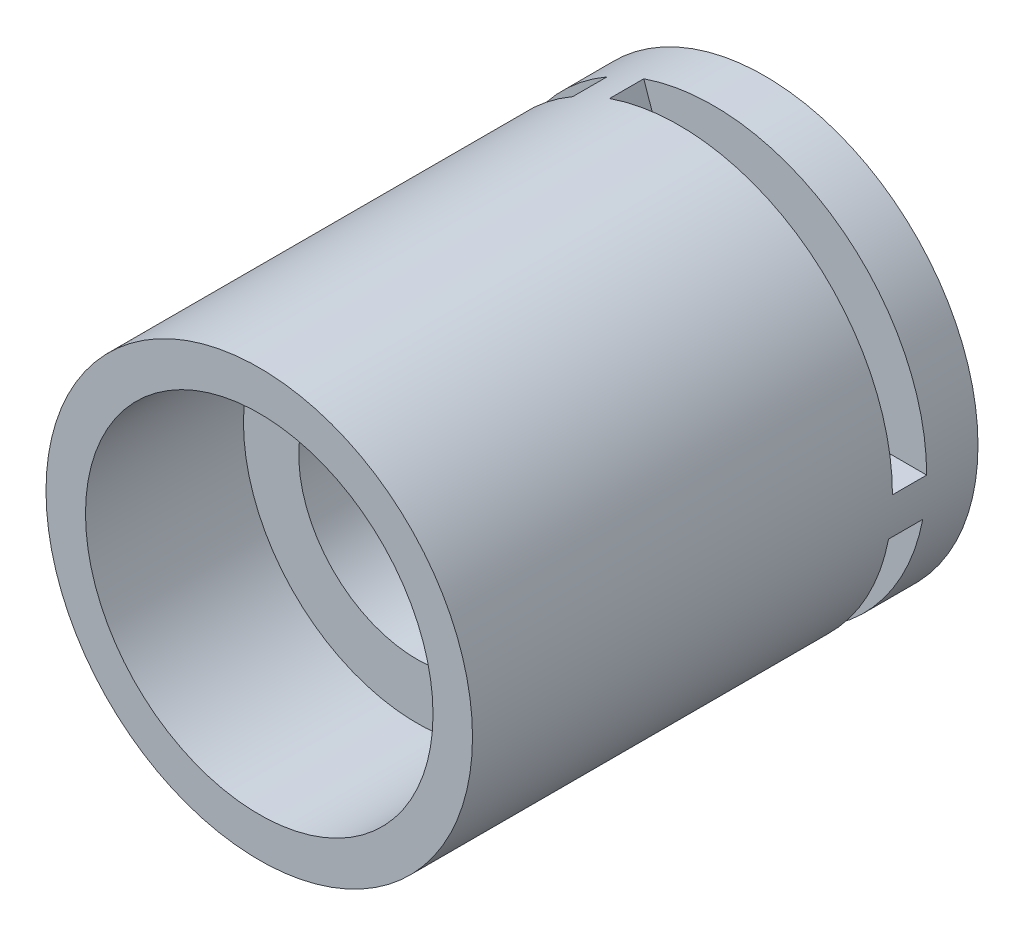
ISO-10303-21;
HEADER;
FILE_DESCRIPTION(('STEP AP214'),'2;1');
FILE_NAME('part.step','',(''),(''),'','','');
FILE_SCHEMA(('AUTOMOTIVE_DESIGN { 1 0 10303 214 1 1 1 1 }'));
ENDSEC;
DATA;
#1=APPLICATION_CONTEXT('core data for automotive mechanical design processes');
#2=APPLICATION_PROTOCOL_DEFINITION('international standard','automotive_design',2000,#1);
#3=PRODUCT_CONTEXT('',#1,'mechanical');
#4=PRODUCT('Part','Part','',(#3));
#5=PRODUCT_RELATED_PRODUCT_CATEGORY('part','',(#4));
#6=PRODUCT_DEFINITION_FORMATION('','',#4);
#7=PRODUCT_DEFINITION_CONTEXT('part definition',#1,'design');
#8=PRODUCT_DEFINITION('design','',#6,#7);
#9=PRODUCT_DEFINITION_SHAPE('','',#8);
#10=(LENGTH_UNIT() NAMED_UNIT(*) SI_UNIT(.MILLI.,.METRE.));
#11=(NAMED_UNIT(*) PLANE_ANGLE_UNIT() SI_UNIT($,.RADIAN.));
#12=(NAMED_UNIT(*) SI_UNIT($,.STERADIAN.) SOLID_ANGLE_UNIT());
#13=UNCERTAINTY_MEASURE_WITH_UNIT(LENGTH_MEASURE(1.E-05),#10,'distance_accuracy_value','');
#14=(GEOMETRIC_REPRESENTATION_CONTEXT(3) GLOBAL_UNCERTAINTY_ASSIGNED_CONTEXT((#13)) GLOBAL_UNIT_ASSIGNED_CONTEXT((#10,
#11,#12)) REPRESENTATION_CONTEXT('',''));
#15=CARTESIAN_POINT('',(0.,0.,0.));
#16=DIRECTION('',(0.,0.,1.));
#17=DIRECTION('',(1.,0.,0.));
#18=AXIS2_PLACEMENT_3D('',#15,#16,#17);
#19=CARTESIAN_POINT('',(0.,0.,-32.));
#20=DIRECTION('',(0.,0.,1.));
#21=DIRECTION('',(1.,0.,0.));
#22=AXIS2_PLACEMENT_3D('',#19,#20,#21);
#23=CYLINDRICAL_SURFACE('',#22,13.5);
#24=DIRECTION('',(0.,0.,-1.));
#25=VECTOR('',#24,1.);
#26=CARTESIAN_POINT('',(-6.76119355948094,-11.6848731979099,-26.584));
#27=LINE('',#26,#25);
#28=CARTESIAN_POINT('',(-6.76119355948094,-11.6848731979099,-26.584));
#29=VERTEX_POINT('',#28);
#30=CARTESIAN_POINT('',(-6.76119355948095,-11.6848731979099,-28.75));
#31=VERTEX_POINT('',#30);
#32=EDGE_CURVE('E233',#29,#31,#27,.T.);
#33=ORIENTED_EDGE('',*,*,#32,.F.);
#34=CARTESIAN_POINT('',(0.,0.,-26.584));
#35=DIRECTION('',(0.,0.,1.));
#36=DIRECTION('',(0.981832280842699,-0.189750816322946,0.));
#37=AXIS2_PLACEMENT_3D('',#34,#35,#36);
#38=CIRCLE('',#37,13.5);
#39=CARTESIAN_POINT('',(13.2547357913764,-2.56163602035977,-26.584));
#40=VERTEX_POINT('',#39);
#41=EDGE_CURVE('E237',#29,#40,#38,.T.);
#42=ORIENTED_EDGE('',*,*,#41,.T.);
#43=DIRECTION('',(0.,0.,1.));
#44=VECTOR('',#43,1.);
#45=CARTESIAN_POINT('',(13.2547357913764,-2.56163602035977,-28.75));
#46=LINE('',#45,#44);
#47=CARTESIAN_POINT('',(13.2547357913764,-2.56163602035977,-28.75));
#48=VERTEX_POINT('',#47);
#49=EDGE_CURVE('E147',#48,#40,#46,.T.);
#50=ORIENTED_EDGE('',*,*,#49,.F.);
#51=CARTESIAN_POINT('',(0.,0.,-28.75));
#52=DIRECTION('',(0.,0.,1.));
#53=DIRECTION('',(0.981832280842699,-0.189750816322946,0.));
#54=AXIS2_PLACEMENT_3D('',#51,#52,#53);
#55=CIRCLE('',#54,13.5);
#56=EDGE_CURVE('E227',#31,#48,#55,.T.);
#57=ORIENTED_EDGE('',*,*,#56,.F.);
#58=EDGE_LOOP('',(#33,#42,#50,#57));
#59=FACE_BOUND('',#58,.T.);
#60=DIRECTION('',(0.,0.,-1.));
#61=VECTOR('',#60,1.);
#62=CARTESIAN_POINT('',(-6.73880024964936,11.6978019813692,-26.584));
#63=LINE('',#62,#61);
#64=CARTESIAN_POINT('',(-6.73880024964936,11.6978019813692,-26.584));
#65=VERTEX_POINT('',#64);
#66=CARTESIAN_POINT('',(-6.73880024964935,11.6978019813692,-28.75));
#67=VERTEX_POINT('',#66);
#68=EDGE_CURVE('E253',#65,#67,#63,.T.);
#69=ORIENTED_EDGE('',*,*,#68,.F.);
#70=CARTESIAN_POINT('',(0.,0.,-26.584));
#71=DIRECTION('',(0.,0.,1.));
#72=DIRECTION('',(-0.655245167745859,-0.755416289303918,0.));
#73=AXIS2_PLACEMENT_3D('',#70,#71,#72);
#74=CIRCLE('',#73,13.5);
#75=CARTESIAN_POINT('',(-8.8458097645691,-10.1981199056029,-26.584));
#76=VERTEX_POINT('',#75);
#77=EDGE_CURVE('E256',#65,#76,#74,.T.);
#78=ORIENTED_EDGE('',*,*,#77,.T.);
#79=DIRECTION('',(0.,0.,1.));
#80=VECTOR('',#79,1.);
#81=CARTESIAN_POINT('',(-8.8458097645691,-10.1981199056029,-28.75));
#82=LINE('',#81,#80);
#83=CARTESIAN_POINT('',(-8.8458097645691,-10.1981199056029,-28.75));
#84=VERTEX_POINT('',#83);
#85=EDGE_CURVE('E247',#84,#76,#82,.T.);
#86=ORIENTED_EDGE('',*,*,#85,.F.);
#87=CARTESIAN_POINT('',(0.,0.,-28.75));
#88=DIRECTION('',(0.,0.,1.));
#89=DIRECTION('',(-0.655245167745859,-0.755416289303918,0.));
#90=AXIS2_PLACEMENT_3D('',#87,#88,#89);
#91=CIRCLE('',#90,13.5);
#92=EDGE_CURVE('E249',#67,#84,#91,.T.);
#93=ORIENTED_EDGE('',*,*,#92,.F.);
#94=EDGE_LOOP('',(#69,#78,#86,#93));
#95=FACE_BOUND('',#94,.T.);
#96=DIRECTION('',(0.,0.,-1.));
#97=VECTOR('',#96,1.);
#98=CARTESIAN_POINT('',(13.4999938091304,-0.0129287834596039,-26.584));
#99=LINE('',#98,#97);
#100=CARTESIAN_POINT('',(13.4999938091304,-0.0129287834596039,-26.584));
#101=VERTEX_POINT('',#100);
#102=CARTESIAN_POINT('',(13.4999938091304,-0.0129287834596068,-28.75));
#103=VERTEX_POINT('',#102);
#104=EDGE_CURVE('E274',#101,#103,#99,.T.);
#105=ORIENTED_EDGE('',*,*,#104,.F.);
#106=CARTESIAN_POINT('',(0.,0.,-26.584));
#107=DIRECTION('',(0.,0.,1.));
#108=DIRECTION('',(-0.326587113096821,0.945167105626875,0.));
#109=AXIS2_PLACEMENT_3D('',#106,#107,#108);
#110=CIRCLE('',#109,13.5);
#111=CARTESIAN_POINT('',(-4.40892602680708,12.7597559259628,-26.584));
#112=VERTEX_POINT('',#111);
#113=EDGE_CURVE('E278',#101,#112,#110,.T.);
#114=ORIENTED_EDGE('',*,*,#113,.T.);
#115=DIRECTION('',(0.,0.,1.));
#116=VECTOR('',#115,1.);
#117=CARTESIAN_POINT('',(-4.40892602680708,12.7597559259628,-28.75));
#118=LINE('',#117,#116);
#119=CARTESIAN_POINT('',(-4.40892602680708,12.7597559259628,-28.75));
#120=VERTEX_POINT('',#119);
#121=EDGE_CURVE('E266',#120,#112,#118,.T.);
#122=ORIENTED_EDGE('',*,*,#121,.F.);
#123=CARTESIAN_POINT('',(0.,0.,-28.75));
#124=DIRECTION('',(0.,0.,1.));
#125=DIRECTION('',(-0.326587113096821,0.945167105626875,0.));
#126=AXIS2_PLACEMENT_3D('',#123,#124,#125);
#127=CIRCLE('',#126,13.5);
#128=EDGE_CURVE('E269',#103,#120,#127,.T.);
#129=ORIENTED_EDGE('',*,*,#128,.F.);
#130=EDGE_LOOP('',(#105,#114,#122,#129));
#131=FACE_BOUND('',#130,.T.);
#132=CARTESIAN_POINT('',(0.,0.,-32.));
#133=DIRECTION('',(0.,0.,1.));
#134=DIRECTION('',(1.,0.,0.));
#135=AXIS2_PLACEMENT_3D('',#132,#133,#134);
#136=CIRCLE('',#135,13.5);
#137=CARTESIAN_POINT('',(13.5,0.,-32.));
#138=VERTEX_POINT('',#137);
#139=EDGE_CURVE('E303',#138,#138,#136,.T.);
#140=ORIENTED_EDGE('',*,*,#139,.T.);
#141=EDGE_LOOP('',(#140));
#142=FACE_BOUND('',#141,.T.);
#143=CARTESIAN_POINT('',(0.,0.,0.));
#144=DIRECTION('',(0.,0.,1.));
#145=DIRECTION('',(1.,0.,0.));
#146=AXIS2_PLACEMENT_3D('',#143,#144,#145);
#147=CIRCLE('',#146,13.5);
#148=CARTESIAN_POINT('',(13.5,0.,0.));
#149=VERTEX_POINT('',#148);
#150=EDGE_CURVE('E299',#149,#149,#147,.T.);
#151=ORIENTED_EDGE('',*,*,#150,.F.);
#152=EDGE_LOOP('',(#151));
#153=FACE_BOUND('',#152,.T.);
#154=ADVANCED_FACE('F133',(#59,#95,#131,#142,#153),#23,.T.);
#155=CARTESIAN_POINT('',(0.,0.,-32.));
#156=DIRECTION('',(0.,0.,1.));
#157=DIRECTION('',(1.,0.,0.));
#158=AXIS2_PLACEMENT_3D('',#155,#156,#157);
#159=PLANE('',#158);
#160=ORIENTED_EDGE('',*,*,#139,.F.);
#161=EDGE_LOOP('',(#160));
#162=FACE_BOUND('',#161,.T.);
#163=ADVANCED_FACE('F353',(#162),#159,.F.);
#164=CARTESIAN_POINT('',(0.,0.,0.));
#165=DIRECTION('',(0.,0.,1.));
#166=DIRECTION('',(1.,0.,0.));
#167=AXIS2_PLACEMENT_3D('',#164,#165,#166);
#168=PLANE('',#167);
#169=CARTESIAN_POINT('',(0.,0.,0.));
#170=DIRECTION('',(0.,0.,1.));
#171=DIRECTION('',(1.,0.,0.));
#172=AXIS2_PLACEMENT_3D('',#169,#170,#171);
#173=CIRCLE('',#172,11.);
#174=CARTESIAN_POINT('',(11.,0.,0.));
#175=VERTEX_POINT('',#174);
#176=EDGE_CURVE('E300',#175,#175,#173,.T.);
#177=ORIENTED_EDGE('',*,*,#176,.F.);
#178=EDGE_LOOP('',(#177));
#179=FACE_BOUND('',#178,.T.);
#180=ORIENTED_EDGE('',*,*,#150,.T.);
#181=EDGE_LOOP('',(#180));
#182=FACE_BOUND('',#181,.T.);
#183=ADVANCED_FACE('F357',(#179,#182),#168,.T.);
#184=CARTESIAN_POINT('',(0.,0.,-10.));
#185=DIRECTION('',(0.,0.,1.));
#186=DIRECTION('',(1.,0.,0.));
#187=AXIS2_PLACEMENT_3D('',#184,#185,#186);
#188=CYLINDRICAL_SURFACE('',#187,11.);
#189=CARTESIAN_POINT('',(0.,0.,-10.));
#190=DIRECTION('',(0.,0.,1.));
#191=DIRECTION('',(1.,0.,0.));
#192=AXIS2_PLACEMENT_3D('',#189,#190,#191);
#193=CIRCLE('',#192,11.);
#194=CARTESIAN_POINT('',(11.,0.,-10.));
#195=VERTEX_POINT('',#194);
#196=EDGE_CURVE('E296',#195,#195,#193,.T.);
#197=ORIENTED_EDGE('',*,*,#196,.F.);
#198=EDGE_LOOP('',(#197));
#199=FACE_BOUND('',#198,.T.);
#200=ORIENTED_EDGE('',*,*,#176,.T.);
#201=EDGE_LOOP('',(#200));
#202=FACE_BOUND('',#201,.T.);
#203=ADVANCED_FACE('F363',(#199,#202),#188,.F.);
#204=CARTESIAN_POINT('',(0.,0.,-10.));
#205=DIRECTION('',(0.,0.,1.));
#206=DIRECTION('',(1.,0.,0.));
#207=AXIS2_PLACEMENT_3D('',#204,#205,#206);
#208=PLANE('',#207);
#209=CARTESIAN_POINT('',(0.,0.,-10.));
#210=DIRECTION('',(0.,0.,1.));
#211=DIRECTION('',(1.,0.,0.));
#212=AXIS2_PLACEMENT_3D('',#209,#210,#211);
#213=CIRCLE('',#212,7.5);
#214=CARTESIAN_POINT('',(7.5,0.,-10.));
#215=VERTEX_POINT('',#214);
#216=EDGE_CURVE('E295',#215,#215,#213,.T.);
#217=ORIENTED_EDGE('',*,*,#216,.F.);
#218=EDGE_LOOP('',(#217));
#219=FACE_BOUND('',#218,.T.);
#220=ORIENTED_EDGE('',*,*,#196,.T.);
#221=EDGE_LOOP('',(#220));
#222=FACE_BOUND('',#221,.T.);
#223=ADVANCED_FACE('F369',(#219,#222),#208,.T.);
#224=CARTESIAN_POINT('',(0.,0.,-30.));
#225=DIRECTION('',(0.,0.,1.));
#226=DIRECTION('',(1.,0.,0.));
#227=AXIS2_PLACEMENT_3D('',#224,#225,#226);
#228=CYLINDRICAL_SURFACE('',#227,7.5);
#229=CARTESIAN_POINT('',(0.,0.,-26.584));
#230=DIRECTION('',(0.,0.,-1.));
#231=DIRECTION('',(-1.,0.,0.));
#232=AXIS2_PLACEMENT_3D('',#229,#230,#231);
#233=CIRCLE('',#232,7.5);
#234=CARTESIAN_POINT('',(7.36374210632024,-1.4231311224221,-26.584));
#235=VERTEX_POINT('',#234);
#236=CARTESIAN_POINT('',(-3.75621864415608,-6.49159622106106,-26.584));
#237=VERTEX_POINT('',#236);
#238=EDGE_CURVE('E334',#235,#237,#233,.T.);
#239=ORIENTED_EDGE('',*,*,#238,.T.);
#240=DIRECTION('',(0.,0.,1.));
#241=VECTOR('',#240,1.);
#242=CARTESIAN_POINT('',(-3.75621864415608,-6.49159622106106,-30.));
#243=LINE('',#242,#241);
#244=CARTESIAN_POINT('',(-3.75621864415609,-6.49159622106106,-28.75));
#245=VERTEX_POINT('',#244);
#246=EDGE_CURVE('E13',#237,#245,#243,.F.);
#247=ORIENTED_EDGE('',*,*,#246,.T.);
#248=CARTESIAN_POINT('',(0.,0.,-28.75));
#249=DIRECTION('',(0.,0.,-1.));
#250=DIRECTION('',(-1.,0.,0.));
#251=AXIS2_PLACEMENT_3D('',#248,#249,#250);
#252=CIRCLE('',#251,7.5);
#253=CARTESIAN_POINT('',(7.36374210632024,-1.4231311224221,-28.75));
#254=VERTEX_POINT('',#253);
#255=EDGE_CURVE('E140',#245,#254,#252,.F.);
#256=ORIENTED_EDGE('',*,*,#255,.T.);
#257=DIRECTION('',(0.,0.,1.));
#258=VECTOR('',#257,1.);
#259=CARTESIAN_POINT('',(7.36374210632024,-1.4231311224221,-30.));
#260=LINE('',#259,#258);
#261=EDGE_CURVE('E337',#254,#235,#260,.T.);
#262=ORIENTED_EDGE('',*,*,#261,.T.);
#263=EDGE_LOOP('',(#239,#247,#256,#262));
#264=FACE_BOUND('',#263,.T.);
#265=CARTESIAN_POINT('',(0.,0.,-26.584));
#266=DIRECTION('',(0.,0.,-1.));
#267=DIRECTION('',(-1.,0.,0.));
#268=AXIS2_PLACEMENT_3D('',#265,#266,#267);
#269=CIRCLE('',#268,7.5);
#270=CARTESIAN_POINT('',(-4.91433875809394,-5.66562216977939,-26.584));
#271=VERTEX_POINT('',#270);
#272=CARTESIAN_POINT('',(-3.74377791647187,6.49877887853846,-26.584));
#273=VERTEX_POINT('',#272);
#274=EDGE_CURVE('E322',#271,#273,#269,.T.);
#275=ORIENTED_EDGE('',*,*,#274,.T.);
#276=DIRECTION('',(0.,0.,1.));
#277=VECTOR('',#276,1.);
#278=CARTESIAN_POINT('',(-3.74377791647187,6.49877887853846,-30.));
#279=LINE('',#278,#277);
#280=CARTESIAN_POINT('',(-3.74377791647186,6.49877887853846,-28.75));
#281=VERTEX_POINT('',#280);
#282=EDGE_CURVE('E331',#273,#281,#279,.F.);
#283=ORIENTED_EDGE('',*,*,#282,.T.);
#284=CARTESIAN_POINT('',(0.,0.,-28.75));
#285=DIRECTION('',(0.,0.,-1.));
#286=DIRECTION('',(-1.,0.,0.));
#287=AXIS2_PLACEMENT_3D('',#284,#285,#286);
#288=CIRCLE('',#287,7.5);
#289=CARTESIAN_POINT('',(-4.91433875809394,-5.66562216977939,-28.75));
#290=VERTEX_POINT('',#289);
#291=EDGE_CURVE('E328',#281,#290,#288,.F.);
#292=ORIENTED_EDGE('',*,*,#291,.T.);
#293=DIRECTION('',(0.,0.,1.));
#294=VECTOR('',#293,1.);
#295=CARTESIAN_POINT('',(-4.91433875809394,-5.66562216977939,-30.));
#296=LINE('',#295,#294);
#297=EDGE_CURVE('E325',#290,#271,#296,.T.);
#298=ORIENTED_EDGE('',*,*,#297,.T.);
#299=EDGE_LOOP('',(#275,#283,#292,#298));
#300=FACE_BOUND('',#299,.T.);
#301=CARTESIAN_POINT('',(0.,0.,-26.584));
#302=DIRECTION('',(0.,0.,-1.));
#303=DIRECTION('',(-1.,0.,0.));
#304=AXIS2_PLACEMENT_3D('',#301,#302,#303);
#305=CIRCLE('',#304,7.5);
#306=CARTESIAN_POINT('',(-2.44940334822615,7.08875329220156,-26.584));
#307=VERTEX_POINT('',#306);
#308=CARTESIAN_POINT('',(7.49999656062798,-0.00718265747755774,-26.584));
#309=VERTEX_POINT('',#308);
#310=EDGE_CURVE('E306',#307,#309,#305,.T.);
#311=ORIENTED_EDGE('',*,*,#310,.T.);
#312=DIRECTION('',(0.,0.,1.));
#313=VECTOR('',#312,1.);
#314=CARTESIAN_POINT('',(7.49999656062798,-0.00718265747755774,-30.));
#315=LINE('',#314,#313);
#316=CARTESIAN_POINT('',(7.49999656062798,-0.00718265747755934,-28.75));
#317=VERTEX_POINT('',#316);
#318=EDGE_CURVE('E319',#309,#317,#315,.F.);
#319=ORIENTED_EDGE('',*,*,#318,.T.);
#320=CARTESIAN_POINT('',(0.,0.,-28.75));
#321=DIRECTION('',(0.,0.,-1.));
#322=DIRECTION('',(-1.,0.,0.));
#323=AXIS2_PLACEMENT_3D('',#320,#321,#322);
#324=CIRCLE('',#323,7.5);
#325=CARTESIAN_POINT('',(-2.44940334822615,7.08875329220156,-28.75));
#326=VERTEX_POINT('',#325);
#327=EDGE_CURVE('E316',#317,#326,#324,.F.);
#328=ORIENTED_EDGE('',*,*,#327,.T.);
#329=DIRECTION('',(0.,0.,1.));
#330=VECTOR('',#329,1.);
#331=CARTESIAN_POINT('',(-2.44940334822615,7.08875329220156,-30.));
#332=LINE('',#331,#330);
#333=EDGE_CURVE('E313',#326,#307,#332,.T.);
#334=ORIENTED_EDGE('',*,*,#333,.T.);
#335=EDGE_LOOP('',(#311,#319,#328,#334));
#336=FACE_BOUND('',#335,.T.);
#337=ORIENTED_EDGE('',*,*,#216,.T.);
#338=EDGE_LOOP('',(#337));
#339=FACE_BOUND('',#338,.T.);
#340=CARTESIAN_POINT('',(0.,0.,-30.));
#341=DIRECTION('',(0.,0.,1.));
#342=DIRECTION('',(1.,0.,0.));
#343=AXIS2_PLACEMENT_3D('',#340,#341,#342);
#344=CIRCLE('',#343,7.5);
#345=CARTESIAN_POINT('',(7.5,0.,-30.));
#346=VERTEX_POINT('',#345);
#347=EDGE_CURVE('E290',#346,#346,#344,.T.);
#348=ORIENTED_EDGE('',*,*,#347,.F.);
#349=EDGE_LOOP('',(#348));
#350=FACE_BOUND('',#349,.T.);
#351=ADVANCED_FACE('F340',(#264,#300,#336,#339,#350),#228,.F.);
#352=CARTESIAN_POINT('',(0.,0.,-30.));
#353=DIRECTION('',(0.,0.,1.));
#354=DIRECTION('',(1.,0.,0.));
#355=AXIS2_PLACEMENT_3D('',#352,#353,#354);
#356=PLANE('',#355);
#357=ORIENTED_EDGE('',*,*,#347,.T.);
#358=EDGE_LOOP('',(#357));
#359=FACE_BOUND('',#358,.T.);
#360=ADVANCED_FACE('F376',(#359),#356,.T.);
#361=CARTESIAN_POINT('',(13.4999938091304,-0.0129287834596039,-27.667));
#362=DIRECTION('',(-0.000957687663674365,-0.999999541417064,0.));
#363=DIRECTION('',(0.,0.,-1.));
#364=AXIS2_PLACEMENT_3D('',#361,#362,#363);
#365=PLANE('',#364);
#366=DIRECTION('',(0.999999541417064,-0.000957687663674365,0.));
#367=VECTOR('',#366,1.);
#368=CARTESIAN_POINT('',(13.4999938091304,-0.0129287834596039,-26.584));
#369=LINE('',#368,#367);
#370=EDGE_CURVE('E288',#309,#101,#369,.T.);
#371=ORIENTED_EDGE('',*,*,#370,.T.);
#372=ORIENTED_EDGE('',*,*,#104,.T.);
#373=DIRECTION('',(0.999999541417064,-0.000957687663674578,0.));
#374=VECTOR('',#373,1.);
#375=CARTESIAN_POINT('',(13.4999938091304,-0.0129287834596068,-28.75));
#376=LINE('',#375,#374);
#377=EDGE_CURVE('E286',#317,#103,#376,.T.);
#378=ORIENTED_EDGE('',*,*,#377,.F.);
#379=ORIENTED_EDGE('',*,*,#318,.F.);
#380=EDGE_LOOP('',(#371,#372,#378,#379));
#381=FACE_BOUND('',#380,.T.);
#382=ADVANCED_FACE('F379',(#381),#365,.F.);
#383=CARTESIAN_POINT('',(0.,0.,-28.75));
#384=DIRECTION('',(0.,0.,-1.));
#385=DIRECTION('',(-1.,0.,0.));
#386=AXIS2_PLACEMENT_3D('',#383,#384,#385);
#387=PLANE('',#386);
#388=ORIENTED_EDGE('',*,*,#377,.T.);
#389=ORIENTED_EDGE('',*,*,#128,.T.);
#390=DIRECTION('',(-0.32658711309682,0.945167105626875,0.));
#391=VECTOR('',#390,1.);
#392=CARTESIAN_POINT('',(-4.40892602680708,12.7597559259628,-28.75));
#393=LINE('',#392,#391);
#394=EDGE_CURVE('E284',#326,#120,#393,.T.);
#395=ORIENTED_EDGE('',*,*,#394,.F.);
#396=ORIENTED_EDGE('',*,*,#327,.F.);
#397=EDGE_LOOP('',(#388,#389,#395,#396));
#398=FACE_BOUND('',#397,.T.);
#399=ADVANCED_FACE('F389',(#398),#387,.F.);
#400=CARTESIAN_POINT('',(-4.40892602680708,12.7597559259628,-27.667));
#401=DIRECTION('',(-0.945167105626875,-0.326587113096821,0.));
#402=DIRECTION('',(0.,0.,1.));
#403=AXIS2_PLACEMENT_3D('',#400,#401,#402);
#404=PLANE('',#403);
#405=ORIENTED_EDGE('',*,*,#394,.T.);
#406=ORIENTED_EDGE('',*,*,#121,.T.);
#407=DIRECTION('',(-0.32658711309682,0.945167105626875,0.));
#408=VECTOR('',#407,1.);
#409=CARTESIAN_POINT('',(-4.40892602680708,12.7597559259628,-26.584));
#410=LINE('',#409,#408);
#411=EDGE_CURVE('E273',#307,#112,#410,.T.);
#412=ORIENTED_EDGE('',*,*,#411,.F.);
#413=ORIENTED_EDGE('',*,*,#333,.F.);
#414=EDGE_LOOP('',(#405,#406,#412,#413));
#415=FACE_BOUND('',#414,.T.);
#416=ADVANCED_FACE('F385',(#415),#404,.F.);
#417=CARTESIAN_POINT('',(0.,0.,-26.584));
#418=DIRECTION('',(0.,0.,-1.));
#419=DIRECTION('',(-1.,0.,0.));
#420=AXIS2_PLACEMENT_3D('',#417,#418,#419);
#421=PLANE('',#420);
#422=ORIENTED_EDGE('',*,*,#411,.T.);
#423=ORIENTED_EDGE('',*,*,#113,.F.);
#424=ORIENTED_EDGE('',*,*,#370,.F.);
#425=ORIENTED_EDGE('',*,*,#310,.F.);
#426=EDGE_LOOP('',(#422,#423,#424,#425));
#427=FACE_BOUND('',#426,.T.);
#428=ADVANCED_FACE('F381',(#427),#421,.T.);
#429=CARTESIAN_POINT('',(-6.73880024964936,11.6978019813692,-27.667));
#430=DIRECTION('',(0.866503850471794,0.499170388862916,0.));
#431=DIRECTION('',(0.,0.,-1.));
#432=AXIS2_PLACEMENT_3D('',#429,#430,#431);
#433=PLANE('',#432);
#434=DIRECTION('',(-0.499170388862916,0.866503850471794,0.));
#435=VECTOR('',#434,1.);
#436=CARTESIAN_POINT('',(-6.73880024964936,11.6978019813692,-26.584));
#437=LINE('',#436,#435);
#438=EDGE_CURVE('E264',#273,#65,#437,.T.);
#439=ORIENTED_EDGE('',*,*,#438,.T.);
#440=ORIENTED_EDGE('',*,*,#68,.T.);
#441=DIRECTION('',(-0.499170388862915,0.866503850471795,0.));
#442=VECTOR('',#441,1.);
#443=CARTESIAN_POINT('',(-6.73880024964935,11.6978019813692,-28.75));
#444=LINE('',#443,#442);
#445=EDGE_CURVE('E262',#281,#67,#444,.T.);
#446=ORIENTED_EDGE('',*,*,#445,.F.);
#447=ORIENTED_EDGE('',*,*,#282,.F.);
#448=EDGE_LOOP('',(#439,#440,#446,#447));
#449=FACE_BOUND('',#448,.T.);
#450=ADVANCED_FACE('F384',(#449),#433,.F.);
#451=CARTESIAN_POINT('',(0.,0.,-28.75));
#452=DIRECTION('',(0.,0.,-1.));
#453=DIRECTION('',(-1.,0.,0.));
#454=AXIS2_PLACEMENT_3D('',#451,#452,#453);
#455=PLANE('',#454);
#456=ORIENTED_EDGE('',*,*,#445,.T.);
#457=ORIENTED_EDGE('',*,*,#92,.T.);
#458=DIRECTION('',(-0.655245167745859,-0.755416289303918,0.));
#459=VECTOR('',#458,1.);
#460=CARTESIAN_POINT('',(-8.8458097645691,-10.1981199056029,-28.75));
#461=LINE('',#460,#459);
#462=EDGE_CURVE('E260',#290,#84,#461,.T.);
#463=ORIENTED_EDGE('',*,*,#462,.F.);
#464=ORIENTED_EDGE('',*,*,#291,.F.);
#465=EDGE_LOOP('',(#456,#457,#463,#464));
#466=FACE_BOUND('',#465,.T.);
#467=ADVANCED_FACE('F404',(#466),#455,.F.);
#468=CARTESIAN_POINT('',(-8.8458097645691,-10.1981199056029,-27.667));
#469=DIRECTION('',(0.755416289303918,-0.655245167745859,0.));
#470=DIRECTION('',(0.,0.,1.));
#471=AXIS2_PLACEMENT_3D('',#468,#469,#470);
#472=PLANE('',#471);
#473=ORIENTED_EDGE('',*,*,#462,.T.);
#474=ORIENTED_EDGE('',*,*,#85,.T.);
#475=DIRECTION('',(-0.655245167745859,-0.755416289303918,0.));
#476=VECTOR('',#475,1.);
#477=CARTESIAN_POINT('',(-8.8458097645691,-10.1981199056029,-26.584));
#478=LINE('',#477,#476);
#479=EDGE_CURVE('E252',#271,#76,#478,.T.);
#480=ORIENTED_EDGE('',*,*,#479,.F.);
#481=ORIENTED_EDGE('',*,*,#297,.F.);
#482=EDGE_LOOP('',(#473,#474,#480,#481));
#483=FACE_BOUND('',#482,.T.);
#484=ADVANCED_FACE('F400',(#483),#472,.F.);
#485=CARTESIAN_POINT('',(0.,0.,-26.584));
#486=DIRECTION('',(0.,0.,-1.));
#487=DIRECTION('',(-1.,0.,0.));
#488=AXIS2_PLACEMENT_3D('',#485,#486,#487);
#489=PLANE('',#488);
#490=ORIENTED_EDGE('',*,*,#479,.T.);
#491=ORIENTED_EDGE('',*,*,#77,.F.);
#492=ORIENTED_EDGE('',*,*,#438,.F.);
#493=ORIENTED_EDGE('',*,*,#274,.F.);
#494=EDGE_LOOP('',(#490,#491,#492,#493));
#495=FACE_BOUND('',#494,.T.);
#496=ADVANCED_FACE('F397',(#495),#489,.T.);
#497=CARTESIAN_POINT('',(-6.76119355948094,-11.6848731979099,-27.667));
#498=DIRECTION('',(-0.865546162808142,0.500829152554144,0.));
#499=DIRECTION('',(0.,0.,-1.));
#500=AXIS2_PLACEMENT_3D('',#497,#498,#499);
#501=PLANE('',#500);
#502=DIRECTION('',(-0.500829152554144,-0.865546162808142,0.));
#503=VECTOR('',#502,1.);
#504=CARTESIAN_POINT('',(-6.76119355948094,-11.6848731979099,-26.584));
#505=LINE('',#504,#503);
#506=EDGE_CURVE('E155',#237,#29,#505,.T.);
#507=ORIENTED_EDGE('',*,*,#506,.T.);
#508=ORIENTED_EDGE('',*,*,#32,.T.);
#509=DIRECTION('',(-0.500829152554145,-0.865546162808141,0.));
#510=VECTOR('',#509,1.);
#511=CARTESIAN_POINT('',(-6.76119355948095,-11.6848731979099,-28.75));
#512=LINE('',#511,#510);
#513=EDGE_CURVE('E222',#245,#31,#512,.T.);
#514=ORIENTED_EDGE('',*,*,#513,.F.);
#515=ORIENTED_EDGE('',*,*,#246,.F.);
#516=EDGE_LOOP('',(#507,#508,#514,#515));
#517=FACE_BOUND('',#516,.T.);
#518=ADVANCED_FACE('F234',(#517),#501,.F.);
#519=CARTESIAN_POINT('',(0.,0.,-28.75));
#520=DIRECTION('',(0.,0.,-1.));
#521=DIRECTION('',(-1.,0.,0.));
#522=AXIS2_PLACEMENT_3D('',#519,#520,#521);
#523=PLANE('',#522);
#524=ORIENTED_EDGE('',*,*,#513,.T.);
#525=ORIENTED_EDGE('',*,*,#56,.T.);
#526=DIRECTION('',(0.981832280842698,-0.189750816322946,0.));
#527=VECTOR('',#526,1.);
#528=CARTESIAN_POINT('',(13.2547357913764,-2.56163602035977,-28.75));
#529=LINE('',#528,#527);
#530=EDGE_CURVE('E230',#254,#48,#529,.T.);
#531=ORIENTED_EDGE('',*,*,#530,.F.);
#532=ORIENTED_EDGE('',*,*,#255,.F.);
#533=EDGE_LOOP('',(#524,#525,#531,#532));
#534=FACE_BOUND('',#533,.T.);
#535=ADVANCED_FACE('F224',(#534),#523,.F.);
#536=CARTESIAN_POINT('',(13.2547357913764,-2.56163602035977,-27.667));
#537=DIRECTION('',(0.189750816322946,0.981832280842699,0.));
#538=DIRECTION('',(0.,0.,1.));
#539=AXIS2_PLACEMENT_3D('',#536,#537,#538);
#540=PLANE('',#539);
#541=ORIENTED_EDGE('',*,*,#530,.T.);
#542=ORIENTED_EDGE('',*,*,#49,.T.);
#543=DIRECTION('',(0.981832280842698,-0.189750816322946,0.));
#544=VECTOR('',#543,1.);
#545=CARTESIAN_POINT('',(13.2547357913764,-2.56163602035977,-26.584));
#546=LINE('',#545,#544);
#547=EDGE_CURVE('E240',#235,#40,#546,.T.);
#548=ORIENTED_EDGE('',*,*,#547,.F.);
#549=ORIENTED_EDGE('',*,*,#261,.F.);
#550=EDGE_LOOP('',(#541,#542,#548,#549));
#551=FACE_BOUND('',#550,.T.);
#552=ADVANCED_FACE('F343',(#551),#540,.F.);
#553=CARTESIAN_POINT('',(0.,0.,-26.584));
#554=DIRECTION('',(0.,0.,-1.));
#555=DIRECTION('',(-1.,0.,0.));
#556=AXIS2_PLACEMENT_3D('',#553,#554,#555);
#557=PLANE('',#556);
#558=ORIENTED_EDGE('',*,*,#547,.T.);
#559=ORIENTED_EDGE('',*,*,#41,.F.);
#560=ORIENTED_EDGE('',*,*,#506,.F.);
#561=ORIENTED_EDGE('',*,*,#238,.F.);
#562=EDGE_LOOP('',(#558,#559,#560,#561));
#563=FACE_BOUND('',#562,.T.);
#564=ADVANCED_FACE('F342',(#563),#557,.T.);
#565=CLOSED_SHELL('',(#154,#163,#183,#203,#223,#351,#360,#382,#399,#416,#428,#450,#467,#484,
#496,#518,#535,#552,#564));
#566=MANIFOLD_SOLID_BREP('B2',#565);
#567=ADVANCED_BREP_SHAPE_REPRESENTATION('',(#18,#566),#14);
#568=SHAPE_DEFINITION_REPRESENTATION(#9,#567);
ENDSEC;
END-ISO-10303-21;
